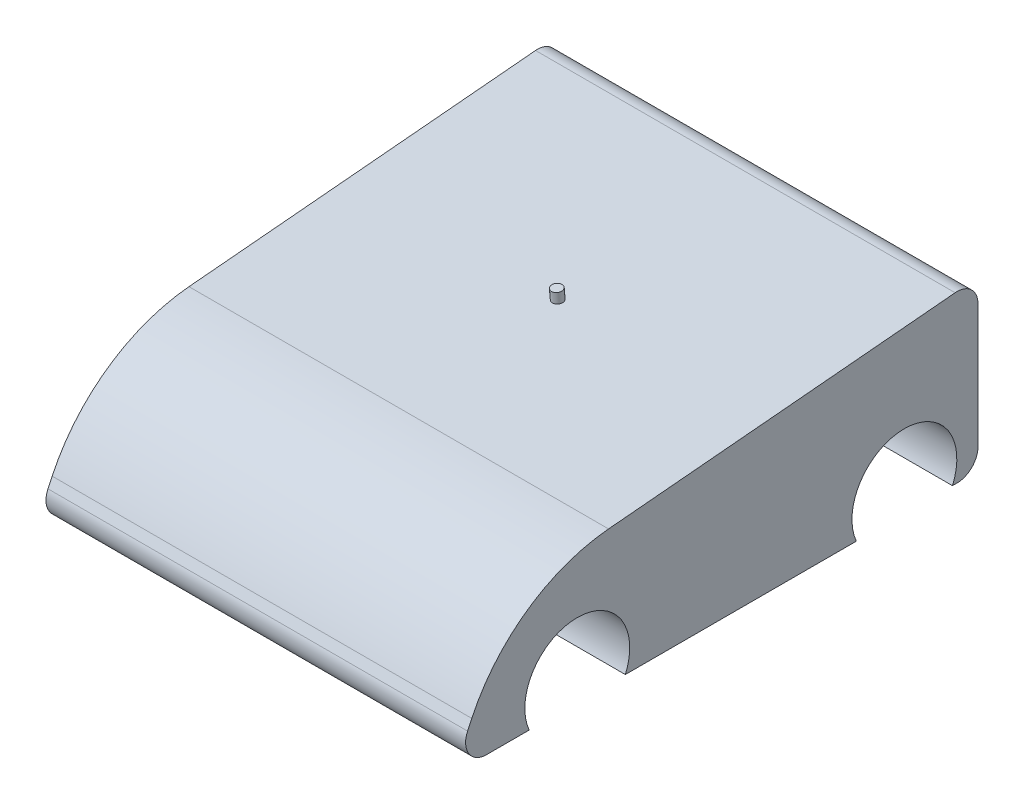
ISO-10303-21;
HEADER;
FILE_DESCRIPTION(('STEP AP214'),'2;1');
FILE_NAME('part.step','',(''),(''),'','','');
FILE_SCHEMA(('AUTOMOTIVE_DESIGN { 1 0 10303 214 1 1 1 1 }'));
ENDSEC;
DATA;
#1=APPLICATION_CONTEXT('core data for automotive mechanical design processes');
#2=APPLICATION_PROTOCOL_DEFINITION('international standard','automotive_design',2000,#1);
#3=PRODUCT_CONTEXT('',#1,'mechanical');
#4=PRODUCT('Part','Part','',(#3));
#5=PRODUCT_RELATED_PRODUCT_CATEGORY('part','',(#4));
#6=PRODUCT_DEFINITION_FORMATION('','',#4);
#7=PRODUCT_DEFINITION_CONTEXT('part definition',#1,'design');
#8=PRODUCT_DEFINITION('design','',#6,#7);
#9=PRODUCT_DEFINITION_SHAPE('','',#8);
#10=(LENGTH_UNIT() NAMED_UNIT(*) SI_UNIT(.MILLI.,.METRE.));
#11=(NAMED_UNIT(*) PLANE_ANGLE_UNIT() SI_UNIT($,.RADIAN.));
#12=(NAMED_UNIT(*) SI_UNIT($,.STERADIAN.) SOLID_ANGLE_UNIT());
#13=UNCERTAINTY_MEASURE_WITH_UNIT(LENGTH_MEASURE(1.E-05),#10,'distance_accuracy_value','');
#14=(GEOMETRIC_REPRESENTATION_CONTEXT(3) GLOBAL_UNCERTAINTY_ASSIGNED_CONTEXT((#13)) GLOBAL_UNIT_ASSIGNED_CONTEXT((#10,
#11,#12)) REPRESENTATION_CONTEXT('',''));
#15=CARTESIAN_POINT('',(0.,0.,0.));
#16=DIRECTION('',(0.,0.,1.));
#17=DIRECTION('',(1.,0.,0.));
#18=AXIS2_PLACEMENT_3D('',#15,#16,#17);
#19=CARTESIAN_POINT('',(100.,0.,-120.64681724846));
#20=DIRECTION('',(0.,1.,0.));
#21=DIRECTION('',(0.,0.,1.));
#22=AXIS2_PLACEMENT_3D('',#19,#20,#21);
#23=PLANE('',#22);
#24=DIRECTION('',(-1.,0.,0.));
#25=VECTOR('',#24,1.);
#26=CARTESIAN_POINT('',(-50.,0.,-118.474582971866));
#27=LINE('',#26,#25);
#28=CARTESIAN_POINT('',(-100.,0.,-118.474582971866));
#29=VERTEX_POINT('',#28);
#30=CARTESIAN_POINT('',(-50.,0.,-118.474582971866));
#31=VERTEX_POINT('',#30);
#32=EDGE_CURVE('E155',#29,#31,#27,.F.);
#33=ORIENTED_EDGE('',*,*,#32,.F.);
#34=DIRECTION('',(0.,0.,-1.));
#35=VECTOR('',#34,1.);
#36=CARTESIAN_POINT('',(-100.,0.,-120.64681724846));
#37=LINE('',#36,#35);
#38=CARTESIAN_POINT('',(-100.,0.,-120.64681724846));
#39=VERTEX_POINT('',#38);
#40=EDGE_CURVE('E218',#29,#39,#37,.T.);
#41=ORIENTED_EDGE('',*,*,#40,.T.);
#42=DIRECTION('',(-1.,0.,0.));
#43=VECTOR('',#42,1.);
#44=CARTESIAN_POINT('',(100.,0.,-120.64681724846));
#45=LINE('',#44,#43);
#46=CARTESIAN_POINT('',(100.,0.,-120.64681724846));
#47=VERTEX_POINT('',#46);
#48=EDGE_CURVE('E240',#47,#39,#45,.T.);
#49=ORIENTED_EDGE('',*,*,#48,.F.);
#50=DIRECTION('',(0.,0.,-1.));
#51=VECTOR('',#50,1.);
#52=CARTESIAN_POINT('',(100.,0.,-120.64681724846));
#53=LINE('',#52,#51);
#54=CARTESIAN_POINT('',(100.,0.,-118.474582971866));
#55=VERTEX_POINT('',#54);
#56=EDGE_CURVE('E198',#55,#47,#53,.T.);
#57=ORIENTED_EDGE('',*,*,#56,.F.);
#58=DIRECTION('',(1.,0.,0.));
#59=VECTOR('',#58,1.);
#60=CARTESIAN_POINT('',(50.,0.,-118.474582971866));
#61=LINE('',#60,#59);
#62=CARTESIAN_POINT('',(50.,0.,-118.474582971866));
#63=VERTEX_POINT('',#62);
#64=EDGE_CURVE('E174',#55,#63,#61,.F.);
#65=ORIENTED_EDGE('',*,*,#64,.T.);
#66=DIRECTION('',(0.,0.,-1.));
#67=VECTOR('',#66,1.);
#68=CARTESIAN_POINT('',(50.,0.,-120.64681724846));
#69=LINE('',#68,#67);
#70=CARTESIAN_POINT('',(50.,0.,-72.6488260223073));
#71=VERTEX_POINT('',#70);
#72=EDGE_CURVE('E260',#71,#63,#69,.T.);
#73=ORIENTED_EDGE('',*,*,#72,.F.);
#74=DIRECTION('',(1.,0.,0.));
#75=VECTOR('',#74,1.);
#76=CARTESIAN_POINT('',(50.,0.,-72.6488260223073));
#77=LINE('',#76,#75);
#78=CARTESIAN_POINT('',(100.,0.,-72.6488260223073));
#79=VERTEX_POINT('',#78);
#80=EDGE_CURVE('E177',#71,#79,#77,.T.);
#81=ORIENTED_EDGE('',*,*,#80,.T.);
#82=CARTESIAN_POINT('',(100.,0.,37.4446152953902));
#83=VERTEX_POINT('',#82);
#84=EDGE_CURVE('E203',#83,#79,#53,.T.);
#85=ORIENTED_EDGE('',*,*,#84,.F.);
#86=DIRECTION('',(1.,0.,0.));
#87=VECTOR('',#86,1.);
#88=CARTESIAN_POINT('',(50.,0.,37.4446152953902));
#89=LINE('',#88,#87);
#90=CARTESIAN_POINT('',(50.,0.,37.4446152953902));
#91=VERTEX_POINT('',#90);
#92=EDGE_CURVE('E183',#83,#91,#89,.F.);
#93=ORIENTED_EDGE('',*,*,#92,.T.);
#94=DIRECTION('',(0.,0.,-1.));
#95=VECTOR('',#94,1.);
#96=CARTESIAN_POINT('',(50.,0.,-120.64681724846));
#97=LINE('',#96,#95);
#98=CARTESIAN_POINT('',(50.,0.,83.2703722449486));
#99=VERTEX_POINT('',#98);
#100=EDGE_CURVE('E255',#99,#91,#97,.T.);
#101=ORIENTED_EDGE('',*,*,#100,.F.);
#102=DIRECTION('',(1.,0.,0.));
#103=VECTOR('',#102,1.);
#104=CARTESIAN_POINT('',(50.,0.,83.2703722449486));
#105=LINE('',#104,#103);
#106=CARTESIAN_POINT('',(100.,0.,83.2703722449486));
#107=VERTEX_POINT('',#106);
#108=EDGE_CURVE('E186',#99,#107,#105,.T.);
#109=ORIENTED_EDGE('',*,*,#108,.T.);
#110=CARTESIAN_POINT('',(100.,0.,103.595649646737));
#111=VERTEX_POINT('',#110);
#112=EDGE_CURVE('E199',#111,#107,#53,.T.);
#113=ORIENTED_EDGE('',*,*,#112,.F.);
#114=DIRECTION('',(-1.,0.,0.));
#115=VECTOR('',#114,1.);
#116=CARTESIAN_POINT('',(100.,0.,103.595649646737));
#117=LINE('',#116,#115);
#118=CARTESIAN_POINT('',(-100.,0.,103.595649646737));
#119=VERTEX_POINT('',#118);
#120=EDGE_CURVE('E243',#111,#119,#117,.T.);
#121=ORIENTED_EDGE('',*,*,#120,.T.);
#122=CARTESIAN_POINT('',(-100.,0.,83.2703722449486));
#123=VERTEX_POINT('',#122);
#124=EDGE_CURVE('E219',#119,#123,#37,.T.);
#125=ORIENTED_EDGE('',*,*,#124,.T.);
#126=DIRECTION('',(-1.,0.,0.));
#127=VECTOR('',#126,1.);
#128=CARTESIAN_POINT('',(-50.,0.,83.2703722449486));
#129=LINE('',#128,#127);
#130=CARTESIAN_POINT('',(-50.,0.,83.2703722449486));
#131=VERTEX_POINT('',#130);
#132=EDGE_CURVE('E57',#131,#123,#129,.T.);
#133=ORIENTED_EDGE('',*,*,#132,.F.);
#134=DIRECTION('',(0.,0.,1.));
#135=VECTOR('',#134,1.);
#136=CARTESIAN_POINT('',(-50.,0.,-120.64681724846));
#137=LINE('',#136,#135);
#138=CARTESIAN_POINT('',(-50.,0.,37.4446152953902));
#139=VERTEX_POINT('',#138);
#140=EDGE_CURVE('E264',#139,#131,#137,.T.);
#141=ORIENTED_EDGE('',*,*,#140,.F.);
#142=DIRECTION('',(-1.,0.,0.));
#143=VECTOR('',#142,1.);
#144=CARTESIAN_POINT('',(-50.,0.,37.4446152953902));
#145=LINE('',#144,#143);
#146=CARTESIAN_POINT('',(-100.,0.,37.4446152953902));
#147=VERTEX_POINT('',#146);
#148=EDGE_CURVE('E169',#147,#139,#145,.F.);
#149=ORIENTED_EDGE('',*,*,#148,.F.);
#150=CARTESIAN_POINT('',(-100.,0.,-72.6488260223073));
#151=VERTEX_POINT('',#150);
#152=EDGE_CURVE('E161',#147,#151,#37,.T.);
#153=ORIENTED_EDGE('',*,*,#152,.T.);
#154=DIRECTION('',(-1.,0.,0.));
#155=VECTOR('',#154,1.);
#156=CARTESIAN_POINT('',(-50.,0.,-72.6488260223073));
#157=LINE('',#156,#155);
#158=CARTESIAN_POINT('',(-50.,0.,-72.6488260223073));
#159=VERTEX_POINT('',#158);
#160=EDGE_CURVE('E49',#159,#151,#157,.T.);
#161=ORIENTED_EDGE('',*,*,#160,.F.);
#162=DIRECTION('',(0.,0.,1.));
#163=VECTOR('',#162,1.);
#164=CARTESIAN_POINT('',(-50.,0.,-120.64681724846));
#165=LINE('',#164,#163);
#166=EDGE_CURVE('E42',#31,#159,#165,.T.);
#167=ORIENTED_EDGE('',*,*,#166,.F.);
#168=EDGE_LOOP('',(#33,#41,#49,#57,#65,#73,#81,#85,#93,#101,#109,#113,#121,#125,#133,#141,#149,
#153,#161,#167));
#169=FACE_BOUND('',#168,.T.);
#170=ADVANCED_FACE('F34',(#169),#23,.F.);
#171=CARTESIAN_POINT('',(100.,-15.5574989256104,38.2592290091834));
#172=DIRECTION('',(-1.,0.,0.));
#173=DIRECTION('',(0.,0.,1.));
#174=AXIS2_PLACEMENT_3D('',#171,#172,#173);
#175=CYLINDRICAL_SURFACE('',#174,80.);
#176=CARTESIAN_POINT('',(-100.,-15.5574989256104,38.2592290091834));
#177=DIRECTION('',(1.,0.,0.));
#178=DIRECTION('',(0.,0.,1.));
#179=AXIS2_PLACEMENT_3D('',#176,#177,#178);
#180=CIRCLE('',#179,80.);
#181=CARTESIAN_POINT('',(-100.,64.1191375635172,45.4448812258877));
#182=VERTEX_POINT('',#181);
#183=CARTESIAN_POINT('',(-100.,18.5050709528454,110.645286598165));
#184=VERTEX_POINT('',#183);
#185=EDGE_CURVE('E189',#182,#184,#180,.T.);
#186=ORIENTED_EDGE('',*,*,#185,.T.);
#187=DIRECTION('',(-1.,0.,0.));
#188=VECTOR('',#187,1.);
#189=CARTESIAN_POINT('',(100.,18.5050709528454,110.645286598165));
#190=LINE('',#189,#188);
#191=CARTESIAN_POINT('',(100.,18.5050709528454,110.645286598165));
#192=VERTEX_POINT('',#191);
#193=EDGE_CURVE('E249',#192,#184,#190,.T.);
#194=ORIENTED_EDGE('',*,*,#193,.F.);
#195=CARTESIAN_POINT('',(100.,-15.5574989256104,38.2592290091834));
#196=DIRECTION('',(1.,0.,0.));
#197=DIRECTION('',(0.,0.,1.));
#198=AXIS2_PLACEMENT_3D('',#195,#196,#197);
#199=CIRCLE('',#198,80.);
#200=CARTESIAN_POINT('',(100.,64.1191375635172,45.4448812258877));
#201=VERTEX_POINT('',#200);
#202=EDGE_CURVE('E190',#201,#192,#199,.T.);
#203=ORIENTED_EDGE('',*,*,#202,.F.);
#204=DIRECTION('',(-1.,0.,0.));
#205=VECTOR('',#204,1.);
#206=CARTESIAN_POINT('',(100.,64.1191375635172,45.4448812258877));
#207=LINE('',#206,#205);
#208=EDGE_CURVE('E211',#201,#182,#207,.T.);
#209=ORIENTED_EDGE('',*,*,#208,.T.);
#210=EDGE_LOOP('',(#186,#194,#203,#209));
#211=FACE_BOUND('',#210,.T.);
#212=ADVANCED_FACE('F36',(#211),#175,.T.);
#213=CARTESIAN_POINT('',(100.,14.2578212348071,112.643906845359));
#214=DIRECTION('',(0.,-0.425782123480702,-0.904825719862264));
#215=DIRECTION('',(0.,0.904825719862264,-0.425782123480702));
#216=AXIS2_PLACEMENT_3D('',#213,#214,#215);
#217=PLANE('',#216);
#218=DIRECTION('',(0.,-0.904825719862264,0.425782123480702));
#219=VECTOR('',#218,1.);
#220=CARTESIAN_POINT('',(-100.,14.2578212348071,112.643906845359));
#221=LINE('',#220,#219);
#222=CARTESIAN_POINT('',(-100.,14.2578212348071,112.643906845359));
#223=VERTEX_POINT('',#222);
#224=EDGE_CURVE('E214',#184,#223,#221,.T.);
#225=ORIENTED_EDGE('',*,*,#224,.T.);
#226=DIRECTION('',(-1.,0.,0.));
#227=VECTOR('',#226,1.);
#228=CARTESIAN_POINT('',(100.,14.2578212348071,112.643906845359));
#229=LINE('',#228,#227);
#230=CARTESIAN_POINT('',(100.,14.2578212348071,112.643906845359));
#231=VERTEX_POINT('',#230);
#232=EDGE_CURVE('E246',#231,#223,#229,.T.);
#233=ORIENTED_EDGE('',*,*,#232,.F.);
#234=DIRECTION('',(0.,-0.904825719862264,0.425782123480702));
#235=VECTOR('',#234,1.);
#236=CARTESIAN_POINT('',(100.,14.2578212348071,112.643906845359));
#237=LINE('',#236,#235);
#238=EDGE_CURVE('E193',#192,#231,#237,.T.);
#239=ORIENTED_EDGE('',*,*,#238,.F.);
#240=ORIENTED_EDGE('',*,*,#193,.T.);
#241=EDGE_LOOP('',(#225,#233,#239,#240));
#242=FACE_BOUND('',#241,.T.);
#243=ADVANCED_FACE('F318',(#242),#217,.F.);
#244=CARTESIAN_POINT('',(100.,10.,103.595649646737));
#245=DIRECTION('',(-1.,0.,0.));
#246=DIRECTION('',(0.,0.,1.));
#247=AXIS2_PLACEMENT_3D('',#244,#245,#246);
#248=CYLINDRICAL_SURFACE('',#247,10.);
#249=CARTESIAN_POINT('',(-100.,10.,103.595649646737));
#250=DIRECTION('',(1.,0.,0.));
#251=DIRECTION('',(0.,0.,-1.));
#252=AXIS2_PLACEMENT_3D('',#249,#250,#251);
#253=CIRCLE('',#252,10.);
#254=EDGE_CURVE('E216',#223,#119,#253,.T.);
#255=ORIENTED_EDGE('',*,*,#254,.T.);
#256=ORIENTED_EDGE('',*,*,#120,.F.);
#257=CARTESIAN_POINT('',(100.,10.,103.595649646737));
#258=DIRECTION('',(1.,0.,0.));
#259=DIRECTION('',(0.,0.,-1.));
#260=AXIS2_PLACEMENT_3D('',#257,#258,#259);
#261=CIRCLE('',#260,10.);
#262=EDGE_CURVE('E196',#231,#111,#261,.T.);
#263=ORIENTED_EDGE('',*,*,#262,.F.);
#264=ORIENTED_EDGE('',*,*,#232,.T.);
#265=EDGE_LOOP('',(#255,#256,#263,#264));
#266=FACE_BOUND('',#265,.T.);
#267=ADVANCED_FACE('F323',(#266),#248,.T.);
#268=CARTESIAN_POINT('',(100.,10.,-120.64681724846));
#269=DIRECTION('',(-1.,0.,0.));
#270=DIRECTION('',(0.,0.,1.));
#271=AXIS2_PLACEMENT_3D('',#268,#269,#270);
#272=CYLINDRICAL_SURFACE('',#271,10.);
#273=CARTESIAN_POINT('',(-100.,10.,-120.64681724846));
#274=DIRECTION('',(1.,0.,0.));
#275=DIRECTION('',(0.,0.,1.));
#276=AXIS2_PLACEMENT_3D('',#273,#274,#275);
#277=CIRCLE('',#276,10.);
#278=CARTESIAN_POINT('',(-100.,10.0000000000001,-130.64681724846));
#279=VERTEX_POINT('',#278);
#280=EDGE_CURVE('E222',#39,#279,#277,.T.);
#281=ORIENTED_EDGE('',*,*,#280,.T.);
#282=DIRECTION('',(-1.,0.,0.));
#283=VECTOR('',#282,1.);
#284=CARTESIAN_POINT('',(100.,10.0000000000001,-130.64681724846));
#285=LINE('',#284,#283);
#286=CARTESIAN_POINT('',(100.,10.0000000000001,-130.64681724846));
#287=VERTEX_POINT('',#286);
#288=EDGE_CURVE('E237',#287,#279,#285,.T.);
#289=ORIENTED_EDGE('',*,*,#288,.F.);
#290=CARTESIAN_POINT('',(100.,10.,-120.64681724846));
#291=DIRECTION('',(1.,0.,0.));
#292=DIRECTION('',(0.,0.,1.));
#293=AXIS2_PLACEMENT_3D('',#290,#291,#292);
#294=CIRCLE('',#293,10.);
#295=EDGE_CURVE('E202',#47,#287,#294,.T.);
#296=ORIENTED_EDGE('',*,*,#295,.F.);
#297=ORIENTED_EDGE('',*,*,#48,.T.);
#298=EDGE_LOOP('',(#281,#289,#296,#297));
#299=FACE_BOUND('',#298,.T.);
#300=ADVANCED_FACE('F274',(#299),#272,.T.);
#301=CARTESIAN_POINT('',(100.,69.0575636650272,-130.64681724846));
#302=DIRECTION('',(0.,0.,1.));
#303=DIRECTION('',(1.,0.,0.));
#304=AXIS2_PLACEMENT_3D('',#301,#302,#303);
#305=PLANE('',#304);
#306=DIRECTION('',(0.,1.,0.));
#307=VECTOR('',#306,1.);
#308=CARTESIAN_POINT('',(-100.,69.0575636650272,-130.64681724846));
#309=LINE('',#308,#307);
#310=CARTESIAN_POINT('',(-100.,69.0575636650272,-130.64681724846));
#311=VERTEX_POINT('',#310);
#312=EDGE_CURVE('E224',#279,#311,#309,.T.);
#313=ORIENTED_EDGE('',*,*,#312,.T.);
#314=DIRECTION('',(-1.,0.,0.));
#315=VECTOR('',#314,1.);
#316=CARTESIAN_POINT('',(100.,69.0575636650272,-130.64681724846));
#317=LINE('',#316,#315);
#318=CARTESIAN_POINT('',(100.,69.0575636650272,-130.64681724846));
#319=VERTEX_POINT('',#318);
#320=EDGE_CURVE('E234',#319,#311,#317,.T.);
#321=ORIENTED_EDGE('',*,*,#320,.F.);
#322=DIRECTION('',(0.,1.,0.));
#323=VECTOR('',#322,1.);
#324=CARTESIAN_POINT('',(100.,69.0575636650272,-130.64681724846));
#325=LINE('',#324,#323);
#326=EDGE_CURVE('E205',#287,#319,#325,.T.);
#327=ORIENTED_EDGE('',*,*,#326,.F.);
#328=ORIENTED_EDGE('',*,*,#288,.T.);
#329=EDGE_LOOP('',(#313,#321,#327,#328));
#330=FACE_BOUND('',#329,.T.);
#331=ADVANCED_FACE('F281',(#330),#305,.F.);
#332=CARTESIAN_POINT('',(100.,69.0575636650273,-120.64681724846));
#333=DIRECTION('',(-1.,0.,0.));
#334=DIRECTION('',(0.,0.,1.));
#335=AXIS2_PLACEMENT_3D('',#332,#333,#334);
#336=CYLINDRICAL_SURFACE('',#335,10.);
#337=CARTESIAN_POINT('',(-100.,69.0575636650273,-120.64681724846));
#338=DIRECTION('',(1.,0.,0.));
#339=DIRECTION('',(0.,0.,1.));
#340=AXIS2_PLACEMENT_3D('',#337,#338,#339);
#341=CIRCLE('',#340,10.);
#342=CARTESIAN_POINT('',(-100.,79.0171432261682,-119.748610721372));
#343=VERTEX_POINT('',#342);
#344=EDGE_CURVE('E226',#311,#343,#341,.T.);
#345=ORIENTED_EDGE('',*,*,#344,.T.);
#346=DIRECTION('',(-1.,0.,0.));
#347=VECTOR('',#346,1.);
#348=CARTESIAN_POINT('',(100.,79.0171432261682,-119.748610721372));
#349=LINE('',#348,#347);
#350=CARTESIAN_POINT('',(100.,79.0171432261682,-119.748610721372));
#351=VERTEX_POINT('',#350);
#352=EDGE_CURVE('E231',#351,#343,#349,.T.);
#353=ORIENTED_EDGE('',*,*,#352,.F.);
#354=CARTESIAN_POINT('',(100.,69.0575636650273,-120.64681724846));
#355=DIRECTION('',(1.,0.,0.));
#356=DIRECTION('',(0.,0.,1.));
#357=AXIS2_PLACEMENT_3D('',#354,#355,#356);
#358=CIRCLE('',#357,10.);
#359=EDGE_CURVE('E207',#319,#351,#358,.T.);
#360=ORIENTED_EDGE('',*,*,#359,.F.);
#361=ORIENTED_EDGE('',*,*,#320,.T.);
#362=EDGE_LOOP('',(#345,#353,#360,#361));
#363=FACE_BOUND('',#362,.T.);
#364=ADVANCED_FACE('F285',(#363),#336,.T.);
#365=CARTESIAN_POINT('',(100.,64.1191375635172,45.4448812258877));
#366=DIRECTION('',(0.,-0.995957956114094,-0.0898206527088083));
#367=DIRECTION('',(0.,0.0898206527088083,-0.995957956114094));
#368=AXIS2_PLACEMENT_3D('',#365,#366,#367);
#369=PLANE('',#368);
#370=CARTESIAN_POINT('',(0.,70.9523668704831,-30.3239858328722));
#371=DIRECTION('',(0.,-0.995957956114094,-0.0898206527088083));
#372=DIRECTION('',(0.,0.0898206527088083,-0.995957956114094));
#373=AXIS2_PLACEMENT_3D('',#370,#371,#372);
#374=CIRCLE('',#373,2.5);
#375=CARTESIAN_POINT('',(0.,71.1769185022551,-32.8138807231575));
#376=VERTEX_POINT('',#375);
#377=EDGE_CURVE('E11',#376,#376,#374,.F.);
#378=ORIENTED_EDGE('',*,*,#377,.F.);
#379=EDGE_LOOP('',(#378));
#380=FACE_BOUND('',#379,.T.);
#381=DIRECTION('',(0.,-0.0898206527088083,0.995957956114094));
#382=VECTOR('',#381,1.);
#383=CARTESIAN_POINT('',(-100.,64.1191375635172,45.4448812258877));
#384=LINE('',#383,#382);
#385=EDGE_CURVE('E194',#343,#182,#384,.T.);
#386=ORIENTED_EDGE('',*,*,#385,.T.);
#387=ORIENTED_EDGE('',*,*,#208,.F.);
#388=DIRECTION('',(0.,-0.0898206527088083,0.995957956114094));
#389=VECTOR('',#388,1.);
#390=CARTESIAN_POINT('',(100.,64.1191375635172,45.4448812258877));
#391=LINE('',#390,#389);
#392=EDGE_CURVE('E209',#351,#201,#391,.T.);
#393=ORIENTED_EDGE('',*,*,#392,.F.);
#394=ORIENTED_EDGE('',*,*,#352,.T.);
#395=EDGE_LOOP('',(#386,#387,#393,#394));
#396=FACE_BOUND('',#395,.T.);
#397=ADVANCED_FACE('F341',(#380,#396),#369,.F.);
#398=CARTESIAN_POINT('',(100.,-15.5574989256104,38.2592290091834));
#399=DIRECTION('',(-1.,0.,0.));
#400=DIRECTION('',(0.,0.,1.));
#401=AXIS2_PLACEMENT_3D('',#398,#399,#400);
#402=PLANE('',#401);
#403=ORIENTED_EDGE('',*,*,#84,.T.);
#404=CARTESIAN_POINT('',(100.,10.,-95.5617044970865));
#405=DIRECTION('',(-1.,0.,0.));
#406=DIRECTION('',(0.,0.,1.));
#407=AXIS2_PLACEMENT_3D('',#404,#405,#406);
#408=CIRCLE('',#407,25.);
#409=EDGE_CURVE('E257',#79,#55,#408,.T.);
#410=ORIENTED_EDGE('',*,*,#409,.T.);
#411=ORIENTED_EDGE('',*,*,#56,.T.);
#412=ORIENTED_EDGE('',*,*,#295,.T.);
#413=ORIENTED_EDGE('',*,*,#326,.T.);
#414=ORIENTED_EDGE('',*,*,#359,.T.);
#415=ORIENTED_EDGE('',*,*,#392,.T.);
#416=ORIENTED_EDGE('',*,*,#202,.T.);
#417=ORIENTED_EDGE('',*,*,#238,.T.);
#418=ORIENTED_EDGE('',*,*,#262,.T.);
#419=ORIENTED_EDGE('',*,*,#112,.T.);
#420=CARTESIAN_POINT('',(100.,10.,60.3574937701694));
#421=DIRECTION('',(-1.,0.,0.));
#422=DIRECTION('',(0.,0.,1.));
#423=AXIS2_PLACEMENT_3D('',#420,#421,#422);
#424=CIRCLE('',#423,25.);
#425=EDGE_CURVE('E252',#107,#83,#424,.T.);
#426=ORIENTED_EDGE('',*,*,#425,.T.);
#427=EDGE_LOOP('',(#403,#410,#411,#412,#413,#414,#415,#416,#417,#418,#419,#426));
#428=FACE_BOUND('',#427,.T.);
#429=ADVANCED_FACE('F290',(#428),#402,.F.);
#430=CARTESIAN_POINT('',(-100.,-15.5574989256104,38.2592290091834));
#431=DIRECTION('',(-1.,0.,0.));
#432=DIRECTION('',(0.,0.,1.));
#433=AXIS2_PLACEMENT_3D('',#430,#431,#432);
#434=PLANE('',#433);
#435=ORIENTED_EDGE('',*,*,#40,.F.);
#436=CARTESIAN_POINT('',(-100.,10.,-95.5617044970865));
#437=DIRECTION('',(-1.,0.,0.));
#438=DIRECTION('',(0.,0.,1.));
#439=AXIS2_PLACEMENT_3D('',#436,#437,#438);
#440=CIRCLE('',#439,25.);
#441=EDGE_CURVE('E153',#29,#151,#440,.F.);
#442=ORIENTED_EDGE('',*,*,#441,.T.);
#443=ORIENTED_EDGE('',*,*,#152,.F.);
#444=CARTESIAN_POINT('',(-100.,10.,60.3574937701694));
#445=DIRECTION('',(-1.,0.,0.));
#446=DIRECTION('',(0.,0.,1.));
#447=AXIS2_PLACEMENT_3D('',#444,#445,#446);
#448=CIRCLE('',#447,25.);
#449=EDGE_CURVE('E262',#147,#123,#448,.F.);
#450=ORIENTED_EDGE('',*,*,#449,.T.);
#451=ORIENTED_EDGE('',*,*,#124,.F.);
#452=ORIENTED_EDGE('',*,*,#254,.F.);
#453=ORIENTED_EDGE('',*,*,#224,.F.);
#454=ORIENTED_EDGE('',*,*,#185,.F.);
#455=ORIENTED_EDGE('',*,*,#385,.F.);
#456=ORIENTED_EDGE('',*,*,#344,.F.);
#457=ORIENTED_EDGE('',*,*,#312,.F.);
#458=ORIENTED_EDGE('',*,*,#280,.F.);
#459=EDGE_LOOP('',(#435,#442,#443,#450,#451,#452,#453,#454,#455,#456,#457,#458));
#460=FACE_BOUND('',#459,.T.);
#461=ADVANCED_FACE('F268',(#460),#434,.T.);
#462=CARTESIAN_POINT('',(50.,10.,60.3574937701694));
#463=DIRECTION('',(1.,0.,0.));
#464=DIRECTION('',(0.,0.,-1.));
#465=AXIS2_PLACEMENT_3D('',#462,#463,#464);
#466=PLANE('',#465);
#467=ORIENTED_EDGE('',*,*,#100,.T.);
#468=CARTESIAN_POINT('',(50.,10.,60.3574937701694));
#469=DIRECTION('',(1.,0.,0.));
#470=DIRECTION('',(0.,0.,-1.));
#471=AXIS2_PLACEMENT_3D('',#468,#469,#470);
#472=CIRCLE('',#471,25.);
#473=EDGE_CURVE('E180',#91,#99,#472,.T.);
#474=ORIENTED_EDGE('',*,*,#473,.T.);
#475=EDGE_LOOP('',(#467,#474));
#476=FACE_BOUND('',#475,.T.);
#477=ADVANCED_FACE('F309',(#476),#466,.T.);
#478=CARTESIAN_POINT('',(50.,10.,60.3574937701694));
#479=DIRECTION('',(1.,0.,0.));
#480=DIRECTION('',(0.,0.,-1.));
#481=AXIS2_PLACEMENT_3D('',#478,#479,#480);
#482=CYLINDRICAL_SURFACE('',#481,25.);
#483=ORIENTED_EDGE('',*,*,#473,.F.);
#484=ORIENTED_EDGE('',*,*,#92,.F.);
#485=ORIENTED_EDGE('',*,*,#425,.F.);
#486=ORIENTED_EDGE('',*,*,#108,.F.);
#487=EDGE_LOOP('',(#483,#484,#485,#486));
#488=FACE_BOUND('',#487,.T.);
#489=ADVANCED_FACE('F301',(#488),#482,.F.);
#490=CARTESIAN_POINT('',(50.,10.,-95.5617044970865));
#491=DIRECTION('',(1.,0.,0.));
#492=DIRECTION('',(0.,0.,-1.));
#493=AXIS2_PLACEMENT_3D('',#490,#491,#492);
#494=PLANE('',#493);
#495=ORIENTED_EDGE('',*,*,#72,.T.);
#496=CARTESIAN_POINT('',(50.,10.,-95.5617044970865));
#497=DIRECTION('',(1.,0.,0.));
#498=DIRECTION('',(0.,0.,-1.));
#499=AXIS2_PLACEMENT_3D('',#496,#497,#498);
#500=CIRCLE('',#499,25.);
#501=EDGE_CURVE('E171',#63,#71,#500,.T.);
#502=ORIENTED_EDGE('',*,*,#501,.T.);
#503=EDGE_LOOP('',(#495,#502));
#504=FACE_BOUND('',#503,.T.);
#505=ADVANCED_FACE('F299',(#504),#494,.T.);
#506=CARTESIAN_POINT('',(50.,10.,-95.5617044970865));
#507=DIRECTION('',(1.,0.,0.));
#508=DIRECTION('',(0.,0.,-1.));
#509=AXIS2_PLACEMENT_3D('',#506,#507,#508);
#510=CYLINDRICAL_SURFACE('',#509,25.);
#511=ORIENTED_EDGE('',*,*,#501,.F.);
#512=ORIENTED_EDGE('',*,*,#64,.F.);
#513=ORIENTED_EDGE('',*,*,#409,.F.);
#514=ORIENTED_EDGE('',*,*,#80,.F.);
#515=EDGE_LOOP('',(#511,#512,#513,#514));
#516=FACE_BOUND('',#515,.T.);
#517=ADVANCED_FACE('F297',(#516),#510,.F.);
#518=CARTESIAN_POINT('',(-50.,10.,60.3574937701694));
#519=DIRECTION('',(-1.,0.,0.));
#520=DIRECTION('',(0.,0.,-1.));
#521=AXIS2_PLACEMENT_3D('',#518,#519,#520);
#522=PLANE('',#521);
#523=ORIENTED_EDGE('',*,*,#140,.T.);
#524=CARTESIAN_POINT('',(-50.,10.,60.3574937701694));
#525=DIRECTION('',(1.,0.,0.));
#526=DIRECTION('',(0.,0.,-1.));
#527=AXIS2_PLACEMENT_3D('',#524,#525,#526);
#528=CIRCLE('',#527,25.);
#529=EDGE_CURVE('E163',#139,#131,#528,.T.);
#530=ORIENTED_EDGE('',*,*,#529,.F.);
#531=EDGE_LOOP('',(#523,#530));
#532=FACE_BOUND('',#531,.T.);
#533=ADVANCED_FACE('F307',(#532),#522,.T.);
#534=CARTESIAN_POINT('',(-50.,10.,60.3574937701694));
#535=DIRECTION('',(-1.,0.,0.));
#536=DIRECTION('',(0.,0.,1.));
#537=AXIS2_PLACEMENT_3D('',#534,#535,#536);
#538=CYLINDRICAL_SURFACE('',#537,25.);
#539=ORIENTED_EDGE('',*,*,#148,.T.);
#540=ORIENTED_EDGE('',*,*,#529,.T.);
#541=ORIENTED_EDGE('',*,*,#132,.T.);
#542=ORIENTED_EDGE('',*,*,#449,.F.);
#543=EDGE_LOOP('',(#539,#540,#541,#542));
#544=FACE_BOUND('',#543,.T.);
#545=ADVANCED_FACE('F425',(#544),#538,.F.);
#546=CARTESIAN_POINT('',(-50.,10.,-95.5617044970865));
#547=DIRECTION('',(-1.,0.,0.));
#548=DIRECTION('',(0.,0.,-1.));
#549=AXIS2_PLACEMENT_3D('',#546,#547,#548);
#550=PLANE('',#549);
#551=ORIENTED_EDGE('',*,*,#166,.T.);
#552=CARTESIAN_POINT('',(-50.,10.,-95.5617044970865));
#553=DIRECTION('',(1.,0.,0.));
#554=DIRECTION('',(0.,0.,-1.));
#555=AXIS2_PLACEMENT_3D('',#552,#553,#554);
#556=CIRCLE('',#555,25.);
#557=EDGE_CURVE('E150',#31,#159,#556,.T.);
#558=ORIENTED_EDGE('',*,*,#557,.F.);
#559=EDGE_LOOP('',(#551,#558));
#560=FACE_BOUND('',#559,.T.);
#561=ADVANCED_FACE('F149',(#560),#550,.T.);
#562=CARTESIAN_POINT('',(-50.,10.,-95.5617044970865));
#563=DIRECTION('',(-1.,0.,0.));
#564=DIRECTION('',(0.,0.,1.));
#565=AXIS2_PLACEMENT_3D('',#562,#563,#564);
#566=CYLINDRICAL_SURFACE('',#565,25.);
#567=ORIENTED_EDGE('',*,*,#32,.T.);
#568=ORIENTED_EDGE('',*,*,#557,.T.);
#569=ORIENTED_EDGE('',*,*,#160,.T.);
#570=ORIENTED_EDGE('',*,*,#441,.F.);
#571=EDGE_LOOP('',(#567,#568,#569,#570));
#572=FACE_BOUND('',#571,.T.);
#573=ADVANCED_FACE('F154',(#572),#566,.F.);
#574=CARTESIAN_POINT('',(0.,75.9321566510536,-29.8748825693282));
#575=DIRECTION('',(0.,-0.995957956114094,-0.0898206527088083));
#576=DIRECTION('',(0.,0.0898206527088083,-0.995957956114094));
#577=AXIS2_PLACEMENT_3D('',#574,#575,#576);
#578=CYLINDRICAL_SURFACE('',#577,2.5);
#579=CARTESIAN_POINT('',(0.,75.9321566510536,-29.8748825693282));
#580=DIRECTION('',(0.,0.995957956114094,0.0898206527088083));
#581=DIRECTION('',(0.,-0.0898206527088083,0.995957956114094));
#582=AXIS2_PLACEMENT_3D('',#579,#580,#581);
#583=CIRCLE('',#582,2.5);
#584=CARTESIAN_POINT('',(0.,75.7076050192816,-27.3849876790429));
#585=VERTEX_POINT('',#584);
#586=EDGE_CURVE('E156',#585,#585,#583,.T.);
#587=ORIENTED_EDGE('',*,*,#586,.F.);
#588=EDGE_LOOP('',(#587));
#589=FACE_BOUND('',#588,.T.);
#590=ORIENTED_EDGE('',*,*,#377,.T.);
#591=EDGE_LOOP('',(#590));
#592=FACE_BOUND('',#591,.T.);
#593=ADVANCED_FACE('F414',(#589,#592),#578,.T.);
#594=CARTESIAN_POINT('',(0.,75.9321566510536,-29.8748825693282));
#595=DIRECTION('',(0.,0.995957956114094,0.0898206527088083));
#596=DIRECTION('',(0.,-0.0898206527088083,0.995957956114094));
#597=AXIS2_PLACEMENT_3D('',#594,#595,#596);
#598=PLANE('',#597);
#599=ORIENTED_EDGE('',*,*,#586,.T.);
#600=EDGE_LOOP('',(#599));
#601=FACE_BOUND('',#600,.T.);
#602=ADVANCED_FACE('F456',(#601),#598,.T.);
#603=CLOSED_SHELL('',(#170,#212,#243,#267,#300,#331,#364,#397,#429,#461,#477,#489,#505,#517,
#533,#545,#561,#573,#593,#602));
#604=MANIFOLD_SOLID_BREP('B2',#603);
#605=ADVANCED_BREP_SHAPE_REPRESENTATION('',(#18,#604),#14);
#606=SHAPE_DEFINITION_REPRESENTATION(#9,#605);
ENDSEC;
END-ISO-10303-21;
